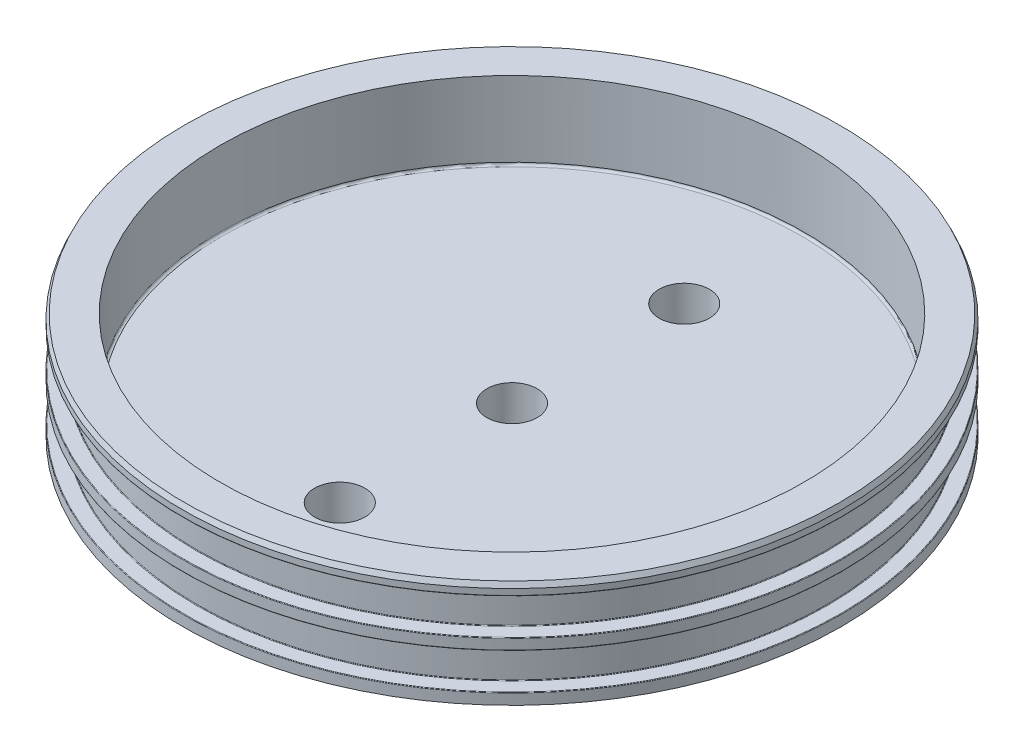
ISO-10303-21;
HEADER;
FILE_DESCRIPTION(('STEP AP214'),'2;1');
FILE_NAME('part.step','',(''),(''),'','','');
FILE_SCHEMA(('AUTOMOTIVE_DESIGN { 1 0 10303 214 1 1 1 1 }'));
ENDSEC;
DATA;
#1=APPLICATION_CONTEXT('core data for automotive mechanical design processes');
#2=APPLICATION_PROTOCOL_DEFINITION('international standard','automotive_design',2000,#1);
#3=PRODUCT_CONTEXT('',#1,'mechanical');
#4=PRODUCT('Part','Part','',(#3));
#5=PRODUCT_RELATED_PRODUCT_CATEGORY('part','',(#4));
#6=PRODUCT_DEFINITION_FORMATION('','',#4);
#7=PRODUCT_DEFINITION_CONTEXT('part definition',#1,'design');
#8=PRODUCT_DEFINITION('design','',#6,#7);
#9=PRODUCT_DEFINITION_SHAPE('','',#8);
#10=(LENGTH_UNIT() NAMED_UNIT(*) SI_UNIT(.MILLI.,.METRE.));
#11=(NAMED_UNIT(*) PLANE_ANGLE_UNIT() SI_UNIT($,.RADIAN.));
#12=(NAMED_UNIT(*) SI_UNIT($,.STERADIAN.) SOLID_ANGLE_UNIT());
#13=UNCERTAINTY_MEASURE_WITH_UNIT(LENGTH_MEASURE(1.E-05),#10,'distance_accuracy_value','');
#14=(GEOMETRIC_REPRESENTATION_CONTEXT(3) GLOBAL_UNCERTAINTY_ASSIGNED_CONTEXT((#13)) GLOBAL_UNIT_ASSIGNED_CONTEXT((#10,
#11,#12)) REPRESENTATION_CONTEXT('',''));
#15=CARTESIAN_POINT('',(0.,0.,0.));
#16=DIRECTION('',(0.,0.,1.));
#17=DIRECTION('',(1.,0.,0.));
#18=AXIS2_PLACEMENT_3D('',#15,#16,#17);
#19=CARTESIAN_POINT('',(0.,-2.54,0.));
#20=DIRECTION('',(0.,-1.,0.));
#21=DIRECTION('',(1.,0.,0.));
#22=AXIS2_PLACEMENT_3D('',#19,#20,#21);
#23=PLANE('',#22);
#24=CARTESIAN_POINT('',(0.,-2.54,38.1));
#25=DIRECTION('',(0.,-1.,0.));
#26=DIRECTION('',(0.,0.,-1.));
#27=AXIS2_PLACEMENT_3D('',#24,#25,#26);
#28=CIRCLE('',#27,5.56259999999999);
#29=CARTESIAN_POINT('',(0.,-2.54,32.5374));
#30=VERTEX_POINT('',#29);
#31=EDGE_CURVE('E80',#30,#30,#28,.T.);
#32=ORIENTED_EDGE('',*,*,#31,.F.);
#33=EDGE_LOOP('',(#32));
#34=FACE_BOUND('',#33,.T.);
#35=CARTESIAN_POINT('',(0.,-2.54,-38.1));
#36=DIRECTION('',(0.,-1.,0.));
#37=DIRECTION('',(0.,0.,-1.));
#38=AXIS2_PLACEMENT_3D('',#35,#36,#37);
#39=CIRCLE('',#38,5.5626);
#40=CARTESIAN_POINT('',(0.,-2.54,-43.6626));
#41=VERTEX_POINT('',#40);
#42=EDGE_CURVE('E66',#41,#41,#39,.T.);
#43=ORIENTED_EDGE('',*,*,#42,.F.);
#44=EDGE_LOOP('',(#43));
#45=FACE_BOUND('',#44,.T.);
#46=CARTESIAN_POINT('',(0.,-2.54,0.));
#47=DIRECTION('',(0.,-1.,0.));
#48=DIRECTION('',(1.,0.,0.));
#49=AXIS2_PLACEMENT_3D('',#46,#47,#48);
#50=CIRCLE('',#49,65.913);
#51=CARTESIAN_POINT('',(65.913,-2.53999999999999,0.));
#52=VERTEX_POINT('',#51);
#53=EDGE_CURVE('E134',#52,#52,#50,.T.);
#54=ORIENTED_EDGE('',*,*,#53,.T.);
#55=EDGE_LOOP('',(#54));
#56=FACE_BOUND('',#55,.T.);
#57=CARTESIAN_POINT('',(0.,-2.54,0.));
#58=DIRECTION('',(0.,1.,0.));
#59=DIRECTION('',(0.,0.,1.));
#60=AXIS2_PLACEMENT_3D('',#57,#58,#59);
#61=CIRCLE('',#60,5.5626);
#62=CARTESIAN_POINT('',(0.,-2.54,5.5626));
#63=VERTEX_POINT('',#62);
#64=EDGE_CURVE('E72',#63,#63,#61,.T.);
#65=ORIENTED_EDGE('',*,*,#64,.T.);
#66=EDGE_LOOP('',(#65));
#67=FACE_BOUND('',#66,.T.);
#68=ADVANCED_FACE('F44',(#34,#45,#56,#67),#23,.T.);
#69=CARTESIAN_POINT('',(0.,0.,0.));
#70=DIRECTION('',(0.,1.,0.));
#71=DIRECTION('',(-1.,0.,0.));
#72=AXIS2_PLACEMENT_3D('',#69,#70,#71);
#73=PLANE('',#72);
#74=CARTESIAN_POINT('',(0.,0.,0.));
#75=DIRECTION('',(0.,1.,0.));
#76=DIRECTION('',(-1.,0.,0.));
#77=AXIS2_PLACEMENT_3D('',#74,#75,#76);
#78=CIRCLE('',#77,66.167);
#79=CARTESIAN_POINT('',(-66.167,0.,0.));
#80=VERTEX_POINT('',#79);
#81=EDGE_CURVE('E98',#80,#80,#78,.T.);
#82=ORIENTED_EDGE('',*,*,#81,.T.);
#83=EDGE_LOOP('',(#82));
#84=FACE_BOUND('',#83,.T.);
#85=CARTESIAN_POINT('',(0.,0.,0.));
#86=DIRECTION('',(0.,1.,0.));
#87=DIRECTION('',(-1.,0.,0.));
#88=AXIS2_PLACEMENT_3D('',#85,#86,#87);
#89=CIRCLE('',#88,72.898);
#90=CARTESIAN_POINT('',(-72.898,0.,0.));
#91=VERTEX_POINT('',#90);
#92=EDGE_CURVE('E90',#91,#91,#89,.T.);
#93=ORIENTED_EDGE('',*,*,#92,.F.);
#94=EDGE_LOOP('',(#93));
#95=FACE_BOUND('',#94,.T.);
#96=ADVANCED_FACE('F208',(#84,#95),#73,.F.);
#97=CARTESIAN_POINT('',(0.,48.1922132313012,0.));
#98=DIRECTION('',(0.,1.,0.));
#99=DIRECTION('',(-1.,0.,0.));
#100=AXIS2_PLACEMENT_3D('',#97,#98,#99);
#101=CYLINDRICAL_SURFACE('',#100,72.898);
#102=CARTESIAN_POINT('',(0.,2.33679999999999,0.));
#103=DIRECTION('',(0.,-1.,0.));
#104=DIRECTION('',(1.,0.,0.));
#105=AXIS2_PLACEMENT_3D('',#102,#103,#104);
#106=CIRCLE('',#105,72.898);
#107=CARTESIAN_POINT('',(72.898,2.3368,0.));
#108=VERTEX_POINT('',#107);
#109=EDGE_CURVE('E170',#108,#108,#106,.T.);
#110=ORIENTED_EDGE('',*,*,#109,.T.);
#111=EDGE_LOOP('',(#110));
#112=FACE_BOUND('',#111,.T.);
#113=ORIENTED_EDGE('',*,*,#92,.T.);
#114=EDGE_LOOP('',(#113));
#115=FACE_BOUND('',#114,.T.);
#116=ADVANCED_FACE('F215',(#112,#115),#101,.T.);
#117=CARTESIAN_POINT('',(72.898,2.4638,0.));
#118=DIRECTION('',(0.,-1.,0.));
#119=DIRECTION('',(1.,0.,0.));
#120=AXIS2_PLACEMENT_3D('',#117,#118,#119);
#121=PLANE('',#120);
#122=CARTESIAN_POINT('',(0.,2.46379999999999,0.));
#123=DIRECTION('',(0.,-1.,0.));
#124=DIRECTION('',(1.,0.,0.));
#125=AXIS2_PLACEMENT_3D('',#122,#123,#124);
#126=CIRCLE('',#125,72.771);
#127=CARTESIAN_POINT('',(72.771,2.4638,0.));
#128=VERTEX_POINT('',#127);
#129=EDGE_CURVE('E166',#128,#128,#126,.F.);
#130=ORIENTED_EDGE('',*,*,#129,.T.);
#131=EDGE_LOOP('',(#130));
#132=FACE_BOUND('',#131,.T.);
#133=CARTESIAN_POINT('',(0.,2.46379999999999,0.));
#134=DIRECTION('',(0.,-1.,0.));
#135=DIRECTION('',(1.,0.,0.));
#136=AXIS2_PLACEMENT_3D('',#133,#134,#135);
#137=CIRCLE('',#136,69.7738);
#138=CARTESIAN_POINT('',(69.7738,2.4638,0.));
#139=VERTEX_POINT('',#138);
#140=EDGE_CURVE('E130',#139,#139,#137,.T.);
#141=ORIENTED_EDGE('',*,*,#140,.T.);
#142=EDGE_LOOP('',(#141));
#143=FACE_BOUND('',#142,.T.);
#144=ADVANCED_FACE('F289',(#132,#143),#121,.F.);
#145=CARTESIAN_POINT('',(0.,48.1922132313012,0.));
#146=DIRECTION('',(0.,1.,0.));
#147=DIRECTION('',(-1.,0.,0.));
#148=AXIS2_PLACEMENT_3D('',#145,#146,#147);
#149=CYLINDRICAL_SURFACE('',#148,69.6468);
#150=CARTESIAN_POINT('',(0.,10.3378,0.));
#151=DIRECTION('',(0.,1.,0.));
#152=DIRECTION('',(-1.,0.,0.));
#153=AXIS2_PLACEMENT_3D('',#150,#151,#152);
#154=CIRCLE('',#153,69.6468);
#155=CARTESIAN_POINT('',(-69.6468,10.3378,0.));
#156=VERTEX_POINT('',#155);
#157=EDGE_CURVE('E126',#156,#156,#154,.F.);
#158=ORIENTED_EDGE('',*,*,#157,.T.);
#159=EDGE_LOOP('',(#158));
#160=FACE_BOUND('',#159,.T.);
#161=CARTESIAN_POINT('',(0.,2.59079999999999,0.));
#162=DIRECTION('',(0.,-1.,0.));
#163=DIRECTION('',(1.,0.,0.));
#164=AXIS2_PLACEMENT_3D('',#161,#162,#163);
#165=CIRCLE('',#164,69.6468);
#166=CARTESIAN_POINT('',(69.6468,2.5908,0.));
#167=VERTEX_POINT('',#166);
#168=EDGE_CURVE('E122',#167,#167,#165,.F.);
#169=ORIENTED_EDGE('',*,*,#168,.T.);
#170=EDGE_LOOP('',(#169));
#171=FACE_BOUND('',#170,.T.);
#172=ADVANCED_FACE('F292',(#160,#171),#149,.T.);
#173=CARTESIAN_POINT('',(69.6468,10.4648,0.));
#174=DIRECTION('',(0.,1.,0.));
#175=DIRECTION('',(-1.,0.,0.));
#176=AXIS2_PLACEMENT_3D('',#173,#174,#175);
#177=PLANE('',#176);
#178=CARTESIAN_POINT('',(0.,10.4648,0.));
#179=DIRECTION('',(0.,1.,0.));
#180=DIRECTION('',(-1.,0.,0.));
#181=AXIS2_PLACEMENT_3D('',#178,#179,#180);
#182=CIRCLE('',#181,72.771);
#183=CARTESIAN_POINT('',(-72.771,10.4648,0.));
#184=VERTEX_POINT('',#183);
#185=EDGE_CURVE('E162',#184,#184,#182,.F.);
#186=ORIENTED_EDGE('',*,*,#185,.T.);
#187=EDGE_LOOP('',(#186));
#188=FACE_BOUND('',#187,.T.);
#189=CARTESIAN_POINT('',(0.,10.4648,0.));
#190=DIRECTION('',(0.,1.,0.));
#191=DIRECTION('',(-1.,0.,0.));
#192=AXIS2_PLACEMENT_3D('',#189,#190,#191);
#193=CIRCLE('',#192,69.7738);
#194=CARTESIAN_POINT('',(-69.7738,10.4648,0.));
#195=VERTEX_POINT('',#194);
#196=EDGE_CURVE('E118',#195,#195,#193,.T.);
#197=ORIENTED_EDGE('',*,*,#196,.T.);
#198=EDGE_LOOP('',(#197));
#199=FACE_BOUND('',#198,.T.);
#200=ADVANCED_FACE('F299',(#188,#199),#177,.F.);
#201=CARTESIAN_POINT('',(0.,48.1922132313012,0.));
#202=DIRECTION('',(0.,1.,0.));
#203=DIRECTION('',(-1.,0.,0.));
#204=AXIS2_PLACEMENT_3D('',#201,#202,#203);
#205=CYLINDRICAL_SURFACE('',#204,72.898);
#206=CARTESIAN_POINT('',(0.,12.8016,0.));
#207=DIRECTION('',(0.,-1.,0.));
#208=DIRECTION('',(1.,0.,0.));
#209=AXIS2_PLACEMENT_3D('',#206,#207,#208);
#210=CIRCLE('',#209,72.898);
#211=CARTESIAN_POINT('',(72.898,12.8016,0.));
#212=VERTEX_POINT('',#211);
#213=EDGE_CURVE('E158',#212,#212,#210,.T.);
#214=ORIENTED_EDGE('',*,*,#213,.T.);
#215=EDGE_LOOP('',(#214));
#216=FACE_BOUND('',#215,.T.);
#217=CARTESIAN_POINT('',(0.,10.5918,0.));
#218=DIRECTION('',(0.,1.,0.));
#219=DIRECTION('',(-1.,0.,0.));
#220=AXIS2_PLACEMENT_3D('',#217,#218,#219);
#221=CIRCLE('',#220,72.898);
#222=CARTESIAN_POINT('',(-72.898,10.5918,0.));
#223=VERTEX_POINT('',#222);
#224=EDGE_CURVE('E154',#223,#223,#221,.T.);
#225=ORIENTED_EDGE('',*,*,#224,.T.);
#226=EDGE_LOOP('',(#225));
#227=FACE_BOUND('',#226,.T.);
#228=ADVANCED_FACE('F305',(#216,#227),#205,.T.);
#229=CARTESIAN_POINT('',(72.898,12.9286,0.));
#230=DIRECTION('',(0.,-1.,0.));
#231=DIRECTION('',(1.,0.,0.));
#232=AXIS2_PLACEMENT_3D('',#229,#230,#231);
#233=PLANE('',#232);
#234=CARTESIAN_POINT('',(0.,12.9286,0.));
#235=DIRECTION('',(0.,-1.,0.));
#236=DIRECTION('',(1.,0.,0.));
#237=AXIS2_PLACEMENT_3D('',#234,#235,#236);
#238=CIRCLE('',#237,72.771);
#239=CARTESIAN_POINT('',(72.771,12.9286,0.));
#240=VERTEX_POINT('',#239);
#241=EDGE_CURVE('E150',#240,#240,#238,.F.);
#242=ORIENTED_EDGE('',*,*,#241,.T.);
#243=EDGE_LOOP('',(#242));
#244=FACE_BOUND('',#243,.T.);
#245=CARTESIAN_POINT('',(0.,12.9286,0.));
#246=DIRECTION('',(0.,-1.,0.));
#247=DIRECTION('',(1.,0.,0.));
#248=AXIS2_PLACEMENT_3D('',#245,#246,#247);
#249=CIRCLE('',#248,69.7738);
#250=CARTESIAN_POINT('',(69.7738,12.9286,0.));
#251=VERTEX_POINT('',#250);
#252=EDGE_CURVE('E114',#251,#251,#249,.T.);
#253=ORIENTED_EDGE('',*,*,#252,.T.);
#254=EDGE_LOOP('',(#253));
#255=FACE_BOUND('',#254,.T.);
#256=ADVANCED_FACE('F336',(#244,#255),#233,.F.);
#257=CARTESIAN_POINT('',(0.,48.1922132313012,0.));
#258=DIRECTION('',(0.,1.,0.));
#259=DIRECTION('',(-1.,0.,0.));
#260=AXIS2_PLACEMENT_3D('',#257,#258,#259);
#261=CYLINDRICAL_SURFACE('',#260,69.6468);
#262=CARTESIAN_POINT('',(0.,20.8026,0.));
#263=DIRECTION('',(0.,1.,0.));
#264=DIRECTION('',(-1.,0.,0.));
#265=AXIS2_PLACEMENT_3D('',#262,#263,#264);
#266=CIRCLE('',#265,69.6468);
#267=CARTESIAN_POINT('',(-69.6468,20.8026,0.));
#268=VERTEX_POINT('',#267);
#269=EDGE_CURVE('E110',#268,#268,#266,.F.);
#270=ORIENTED_EDGE('',*,*,#269,.T.);
#271=EDGE_LOOP('',(#270));
#272=FACE_BOUND('',#271,.T.);
#273=CARTESIAN_POINT('',(0.,13.0556,0.));
#274=DIRECTION('',(0.,-1.,0.));
#275=DIRECTION('',(1.,0.,0.));
#276=AXIS2_PLACEMENT_3D('',#273,#274,#275);
#277=CIRCLE('',#276,69.6468);
#278=CARTESIAN_POINT('',(69.6468,13.0556,0.));
#279=VERTEX_POINT('',#278);
#280=EDGE_CURVE('E106',#279,#279,#277,.F.);
#281=ORIENTED_EDGE('',*,*,#280,.T.);
#282=EDGE_LOOP('',(#281));
#283=FACE_BOUND('',#282,.T.);
#284=ADVANCED_FACE('F343',(#272,#283),#261,.T.);
#285=CARTESIAN_POINT('',(69.6468,20.9296,0.));
#286=DIRECTION('',(0.,1.,0.));
#287=DIRECTION('',(-1.,0.,0.));
#288=AXIS2_PLACEMENT_3D('',#285,#286,#287);
#289=PLANE('',#288);
#290=CARTESIAN_POINT('',(0.,20.9296,0.));
#291=DIRECTION('',(0.,1.,0.));
#292=DIRECTION('',(-1.,0.,0.));
#293=AXIS2_PLACEMENT_3D('',#290,#291,#292);
#294=CIRCLE('',#293,72.771);
#295=CARTESIAN_POINT('',(-72.771,20.9296,0.));
#296=VERTEX_POINT('',#295);
#297=EDGE_CURVE('E146',#296,#296,#294,.F.);
#298=ORIENTED_EDGE('',*,*,#297,.T.);
#299=EDGE_LOOP('',(#298));
#300=FACE_BOUND('',#299,.T.);
#301=CARTESIAN_POINT('',(0.,20.9296,0.));
#302=DIRECTION('',(0.,1.,0.));
#303=DIRECTION('',(-1.,0.,0.));
#304=AXIS2_PLACEMENT_3D('',#301,#302,#303);
#305=CIRCLE('',#304,69.7738);
#306=CARTESIAN_POINT('',(-69.7738,20.9296,0.));
#307=VERTEX_POINT('',#306);
#308=EDGE_CURVE('E102',#307,#307,#305,.T.);
#309=ORIENTED_EDGE('',*,*,#308,.T.);
#310=EDGE_LOOP('',(#309));
#311=FACE_BOUND('',#310,.T.);
#312=ADVANCED_FACE('F350',(#300,#311),#289,.F.);
#313=CARTESIAN_POINT('',(0.,48.1922132313012,0.));
#314=DIRECTION('',(0.,1.,0.));
#315=DIRECTION('',(-1.,0.,0.));
#316=AXIS2_PLACEMENT_3D('',#313,#314,#315);
#317=CYLINDRICAL_SURFACE('',#316,72.898);
#318=CARTESIAN_POINT('',(0.,22.3801904843811,0.));
#319=DIRECTION('',(0.,-1.,0.));
#320=DIRECTION('',(1.,0.,0.));
#321=AXIS2_PLACEMENT_3D('',#318,#319,#320);
#322=CIRCLE('',#321,72.898);
#323=CARTESIAN_POINT('',(72.898,22.3801904843811,0.));
#324=VERTEX_POINT('',#323);
#325=EDGE_CURVE('E59',#324,#324,#322,.T.);
#326=ORIENTED_EDGE('',*,*,#325,.T.);
#327=EDGE_LOOP('',(#326));
#328=FACE_BOUND('',#327,.T.);
#329=CARTESIAN_POINT('',(0.,21.0566,0.));
#330=DIRECTION('',(0.,1.,0.));
#331=DIRECTION('',(-1.,0.,0.));
#332=AXIS2_PLACEMENT_3D('',#329,#330,#331);
#333=CIRCLE('',#332,72.898);
#334=CARTESIAN_POINT('',(-72.898,21.0566,0.));
#335=VERTEX_POINT('',#334);
#336=EDGE_CURVE('E142',#335,#335,#333,.T.);
#337=ORIENTED_EDGE('',*,*,#336,.T.);
#338=EDGE_LOOP('',(#337));
#339=FACE_BOUND('',#338,.T.);
#340=ADVANCED_FACE('F181',(#328,#339),#317,.T.);
#341=CARTESIAN_POINT('',(72.898,23.4696,0.));
#342=DIRECTION('',(0.,-1.,0.));
#343=DIRECTION('',(1.,0.,0.));
#344=AXIS2_PLACEMENT_3D('',#341,#342,#343);
#345=PLANE('',#344);
#346=CARTESIAN_POINT('',(0.,23.4696,0.));
#347=DIRECTION('',(0.,-1.,0.));
#348=DIRECTION('',(1.,0.,0.));
#349=AXIS2_PLACEMENT_3D('',#346,#347,#348);
#350=CIRCLE('',#349,72.39);
#351=CARTESIAN_POINT('',(72.39,23.4696,0.));
#352=VERTEX_POINT('',#351);
#353=EDGE_CURVE('E174',#352,#352,#350,.F.);
#354=ORIENTED_EDGE('',*,*,#353,.T.);
#355=EDGE_LOOP('',(#354));
#356=FACE_BOUND('',#355,.T.);
#357=CARTESIAN_POINT('',(0.,23.4696,0.));
#358=DIRECTION('',(0.,1.,0.));
#359=DIRECTION('',(-1.,0.,0.));
#360=AXIS2_PLACEMENT_3D('',#357,#358,#359);
#361=CIRCLE('',#360,64.5668);
#362=CARTESIAN_POINT('',(-64.5668,23.4696,0.));
#363=VERTEX_POINT('',#362);
#364=EDGE_CURVE('E86',#363,#363,#361,.T.);
#365=ORIENTED_EDGE('',*,*,#364,.F.);
#366=EDGE_LOOP('',(#365));
#367=FACE_BOUND('',#366,.T.);
#368=ADVANCED_FACE('F190',(#356,#367),#345,.F.);
#369=CARTESIAN_POINT('',(0.,48.1922132313012,0.));
#370=DIRECTION('',(0.,1.,0.));
#371=DIRECTION('',(-1.,0.,0.));
#372=AXIS2_PLACEMENT_3D('',#369,#370,#371);
#373=CYLINDRICAL_SURFACE('',#372,64.5668);
#374=CARTESIAN_POINT('',(0.,6.858,0.));
#375=DIRECTION('',(0.,-1.,0.));
#376=DIRECTION('',(1.,0.,0.));
#377=AXIS2_PLACEMENT_3D('',#374,#375,#376);
#378=CIRCLE('',#377,64.5668);
#379=CARTESIAN_POINT('',(64.5668,6.858,0.));
#380=VERTEX_POINT('',#379);
#381=EDGE_CURVE('E10',#380,#380,#378,.T.);
#382=ORIENTED_EDGE('',*,*,#381,.T.);
#383=EDGE_LOOP('',(#382));
#384=FACE_BOUND('',#383,.T.);
#385=ORIENTED_EDGE('',*,*,#364,.T.);
#386=EDGE_LOOP('',(#385));
#387=FACE_BOUND('',#386,.T.);
#388=ADVANCED_FACE('F193',(#384,#387),#373,.F.);
#389=CARTESIAN_POINT('',(64.5668,6.35,0.));
#390=DIRECTION('',(0.,-1.,0.));
#391=DIRECTION('',(1.,0.,0.));
#392=AXIS2_PLACEMENT_3D('',#389,#390,#391);
#393=PLANE('',#392);
#394=CARTESIAN_POINT('',(0.,6.34999999999999,38.1));
#395=DIRECTION('',(0.,-1.,0.));
#396=DIRECTION('',(1.,0.,0.));
#397=AXIS2_PLACEMENT_3D('',#394,#395,#396);
#398=CIRCLE('',#397,5.56259999999999);
#399=CARTESIAN_POINT('',(5.56259999999999,6.34999999999999,38.1));
#400=VERTEX_POINT('',#399);
#401=EDGE_CURVE('E48',#400,#400,#398,.T.);
#402=ORIENTED_EDGE('',*,*,#401,.T.);
#403=EDGE_LOOP('',(#402));
#404=FACE_BOUND('',#403,.T.);
#405=CARTESIAN_POINT('',(0.,6.34999999999999,-38.1));
#406=DIRECTION('',(0.,-1.,0.));
#407=DIRECTION('',(1.,0.,0.));
#408=AXIS2_PLACEMENT_3D('',#405,#406,#407);
#409=CIRCLE('',#408,5.5626);
#410=CARTESIAN_POINT('',(5.5626,6.34999999999999,-38.1));
#411=VERTEX_POINT('',#410);
#412=EDGE_CURVE('E62',#411,#411,#409,.T.);
#413=ORIENTED_EDGE('',*,*,#412,.T.);
#414=EDGE_LOOP('',(#413));
#415=FACE_BOUND('',#414,.T.);
#416=CARTESIAN_POINT('',(0.,6.34999999999999,0.));
#417=DIRECTION('',(0.,-1.,0.));
#418=DIRECTION('',(1.,0.,0.));
#419=AXIS2_PLACEMENT_3D('',#416,#417,#418);
#420=CIRCLE('',#419,64.0588);
#421=CARTESIAN_POINT('',(64.0588,6.35,0.));
#422=VERTEX_POINT('',#421);
#423=EDGE_CURVE('E53',#422,#422,#420,.F.);
#424=ORIENTED_EDGE('',*,*,#423,.T.);
#425=EDGE_LOOP('',(#424));
#426=FACE_BOUND('',#425,.T.);
#427=CARTESIAN_POINT('',(0.,6.34999999999999,0.));
#428=DIRECTION('',(0.,1.,0.));
#429=DIRECTION('',(0.,0.,1.));
#430=AXIS2_PLACEMENT_3D('',#427,#428,#429);
#431=CIRCLE('',#430,5.56259999999999);
#432=CARTESIAN_POINT('',(0.,6.34999999999999,5.56259999999999));
#433=VERTEX_POINT('',#432);
#434=EDGE_CURVE('E65',#433,#433,#431,.T.);
#435=ORIENTED_EDGE('',*,*,#434,.F.);
#436=EDGE_LOOP('',(#435));
#437=FACE_BOUND('',#436,.T.);
#438=ADVANCED_FACE('F198',(#404,#415,#426,#437),#393,.F.);
#439=CARTESIAN_POINT('',(0.,-2.54,0.));
#440=DIRECTION('',(0.,1.,0.));
#441=DIRECTION('',(-1.,0.,0.));
#442=AXIS2_PLACEMENT_3D('',#439,#440,#441);
#443=CYLINDRICAL_SURFACE('',#442,66.04);
#444=CARTESIAN_POINT('',(0.,-2.413,0.));
#445=DIRECTION('',(0.,-1.,0.));
#446=DIRECTION('',(1.,0.,0.));
#447=AXIS2_PLACEMENT_3D('',#444,#445,#446);
#448=CIRCLE('',#447,66.04);
#449=CARTESIAN_POINT('',(66.04,-2.41299999999999,0.));
#450=VERTEX_POINT('',#449);
#451=EDGE_CURVE('E138',#450,#450,#448,.F.);
#452=ORIENTED_EDGE('',*,*,#451,.T.);
#453=EDGE_LOOP('',(#452));
#454=FACE_BOUND('',#453,.T.);
#455=CARTESIAN_POINT('',(0.,-0.127000000000004,0.));
#456=DIRECTION('',(0.,1.,0.));
#457=DIRECTION('',(-1.,0.,0.));
#458=AXIS2_PLACEMENT_3D('',#455,#456,#457);
#459=CIRCLE('',#458,66.04);
#460=CARTESIAN_POINT('',(-66.04,-0.127000000000012,0.));
#461=VERTEX_POINT('',#460);
#462=EDGE_CURVE('E94',#461,#461,#459,.F.);
#463=ORIENTED_EDGE('',*,*,#462,.T.);
#464=EDGE_LOOP('',(#463));
#465=FACE_BOUND('',#464,.T.);
#466=ADVANCED_FACE('F204',(#454,#465),#443,.T.);
#467=CARTESIAN_POINT('',(0.,6.34999999999999,0.));
#468=DIRECTION('',(0.,1.,0.));
#469=DIRECTION('',(0.,0.,1.));
#470=AXIS2_PLACEMENT_3D('',#467,#468,#469);
#471=CYLINDRICAL_SURFACE('',#470,5.56259999999999);
#472=ORIENTED_EDGE('',*,*,#64,.F.);
#473=EDGE_LOOP('',(#472));
#474=FACE_BOUND('',#473,.T.);
#475=ORIENTED_EDGE('',*,*,#434,.T.);
#476=EDGE_LOOP('',(#475));
#477=FACE_BOUND('',#476,.T.);
#478=ADVANCED_FACE('F222',(#474,#477),#471,.F.);
#479=CARTESIAN_POINT('',(0.,-0.127000000000004,0.));
#480=DIRECTION('',(0.,1.,0.));
#481=DIRECTION('',(-1.,0.,0.));
#482=AXIS2_PLACEMENT_3D('',#479,#480,#481);
#483=TOROIDAL_SURFACE('',#482,66.167,0.127);
#484=ORIENTED_EDGE('',*,*,#81,.F.);
#485=EDGE_LOOP('',(#484));
#486=FACE_BOUND('',#485,.T.);
#487=ORIENTED_EDGE('',*,*,#462,.F.);
#488=EDGE_LOOP('',(#487));
#489=FACE_BOUND('',#488,.T.);
#490=ADVANCED_FACE('F231',(#486,#489),#483,.F.);
#491=CARTESIAN_POINT('',(0.,20.8026,0.));
#492=DIRECTION('',(0.,1.,0.));
#493=DIRECTION('',(-1.,0.,0.));
#494=AXIS2_PLACEMENT_3D('',#491,#492,#493);
#495=TOROIDAL_SURFACE('',#494,69.7738,0.127);
#496=ORIENTED_EDGE('',*,*,#269,.F.);
#497=EDGE_LOOP('',(#496));
#498=FACE_BOUND('',#497,.T.);
#499=ORIENTED_EDGE('',*,*,#308,.F.);
#500=EDGE_LOOP('',(#499));
#501=FACE_BOUND('',#500,.T.);
#502=ADVANCED_FACE('F238',(#498,#501),#495,.F.);
#503=CARTESIAN_POINT('',(0.,13.0556,0.));
#504=DIRECTION('',(0.,-1.,0.));
#505=DIRECTION('',(1.,0.,0.));
#506=AXIS2_PLACEMENT_3D('',#503,#504,#505);
#507=TOROIDAL_SURFACE('',#506,69.7738,0.127);
#508=ORIENTED_EDGE('',*,*,#252,.F.);
#509=EDGE_LOOP('',(#508));
#510=FACE_BOUND('',#509,.T.);
#511=ORIENTED_EDGE('',*,*,#280,.F.);
#512=EDGE_LOOP('',(#511));
#513=FACE_BOUND('',#512,.T.);
#514=ADVANCED_FACE('F245',(#510,#513),#507,.F.);
#515=CARTESIAN_POINT('',(0.,10.3378,0.));
#516=DIRECTION('',(0.,1.,0.));
#517=DIRECTION('',(-1.,0.,0.));
#518=AXIS2_PLACEMENT_3D('',#515,#516,#517);
#519=TOROIDAL_SURFACE('',#518,69.7738,0.127);
#520=ORIENTED_EDGE('',*,*,#157,.F.);
#521=EDGE_LOOP('',(#520));
#522=FACE_BOUND('',#521,.T.);
#523=ORIENTED_EDGE('',*,*,#196,.F.);
#524=EDGE_LOOP('',(#523));
#525=FACE_BOUND('',#524,.T.);
#526=ADVANCED_FACE('F253',(#522,#525),#519,.F.);
#527=CARTESIAN_POINT('',(0.,2.59079999999999,0.));
#528=DIRECTION('',(0.,-1.,0.));
#529=DIRECTION('',(1.,0.,0.));
#530=AXIS2_PLACEMENT_3D('',#527,#528,#529);
#531=TOROIDAL_SURFACE('',#530,69.7738,0.127);
#532=ORIENTED_EDGE('',*,*,#140,.F.);
#533=EDGE_LOOP('',(#532));
#534=FACE_BOUND('',#533,.T.);
#535=ORIENTED_EDGE('',*,*,#168,.F.);
#536=EDGE_LOOP('',(#535));
#537=FACE_BOUND('',#536,.T.);
#538=ADVANCED_FACE('F257',(#534,#537),#531,.F.);
#539=CARTESIAN_POINT('',(0.,-2.413,0.));
#540=DIRECTION('',(0.,-1.,0.));
#541=DIRECTION('',(1.,0.,0.));
#542=AXIS2_PLACEMENT_3D('',#539,#540,#541);
#543=TOROIDAL_SURFACE('',#542,65.913,0.127);
#544=ORIENTED_EDGE('',*,*,#451,.F.);
#545=EDGE_LOOP('',(#544));
#546=FACE_BOUND('',#545,.T.);
#547=ORIENTED_EDGE('',*,*,#53,.F.);
#548=EDGE_LOOP('',(#547));
#549=FACE_BOUND('',#548,.T.);
#550=ADVANCED_FACE('F261',(#546,#549),#543,.T.);
#551=CARTESIAN_POINT('',(0.,21.0566,0.));
#552=DIRECTION('',(0.,1.,0.));
#553=DIRECTION('',(-1.,0.,0.));
#554=AXIS2_PLACEMENT_3D('',#551,#552,#553);
#555=TOROIDAL_SURFACE('',#554,72.771,0.127);
#556=ORIENTED_EDGE('',*,*,#297,.F.);
#557=EDGE_LOOP('',(#556));
#558=FACE_BOUND('',#557,.T.);
#559=ORIENTED_EDGE('',*,*,#336,.F.);
#560=EDGE_LOOP('',(#559));
#561=FACE_BOUND('',#560,.T.);
#562=ADVANCED_FACE('F264',(#558,#561),#555,.T.);
#563=CARTESIAN_POINT('',(0.,12.8016,0.));
#564=DIRECTION('',(0.,-1.,0.));
#565=DIRECTION('',(1.,0.,0.));
#566=AXIS2_PLACEMENT_3D('',#563,#564,#565);
#567=TOROIDAL_SURFACE('',#566,72.771,0.127);
#568=ORIENTED_EDGE('',*,*,#213,.F.);
#569=EDGE_LOOP('',(#568));
#570=FACE_BOUND('',#569,.T.);
#571=ORIENTED_EDGE('',*,*,#241,.F.);
#572=EDGE_LOOP('',(#571));
#573=FACE_BOUND('',#572,.T.);
#574=ADVANCED_FACE('F268',(#570,#573),#567,.T.);
#575=CARTESIAN_POINT('',(0.,10.5918,0.));
#576=DIRECTION('',(0.,1.,0.));
#577=DIRECTION('',(-1.,0.,0.));
#578=AXIS2_PLACEMENT_3D('',#575,#576,#577);
#579=TOROIDAL_SURFACE('',#578,72.771,0.127);
#580=ORIENTED_EDGE('',*,*,#185,.F.);
#581=EDGE_LOOP('',(#580));
#582=FACE_BOUND('',#581,.T.);
#583=ORIENTED_EDGE('',*,*,#224,.F.);
#584=EDGE_LOOP('',(#583));
#585=FACE_BOUND('',#584,.T.);
#586=ADVANCED_FACE('F272',(#582,#585),#579,.T.);
#587=CARTESIAN_POINT('',(0.,2.33679999999999,0.));
#588=DIRECTION('',(0.,-1.,0.));
#589=DIRECTION('',(1.,0.,0.));
#590=AXIS2_PLACEMENT_3D('',#587,#588,#589);
#591=TOROIDAL_SURFACE('',#590,72.771,0.127);
#592=ORIENTED_EDGE('',*,*,#109,.F.);
#593=EDGE_LOOP('',(#592));
#594=FACE_BOUND('',#593,.T.);
#595=ORIENTED_EDGE('',*,*,#129,.F.);
#596=EDGE_LOOP('',(#595));
#597=FACE_BOUND('',#596,.T.);
#598=ADVANCED_FACE('F187',(#594,#597),#591,.T.);
#599=CARTESIAN_POINT('',(0.,23.4696,0.));
#600=DIRECTION('',(0.,-1.,0.));
#601=DIRECTION('',(1.,0.,0.));
#602=AXIS2_PLACEMENT_3D('',#599,#600,#601);
#603=CONICAL_SURFACE('',#602,72.39,0.436332312998576);
#604=ORIENTED_EDGE('',*,*,#325,.F.);
#605=EDGE_LOOP('',(#604));
#606=FACE_BOUND('',#605,.T.);
#607=ORIENTED_EDGE('',*,*,#353,.F.);
#608=EDGE_LOOP('',(#607));
#609=FACE_BOUND('',#608,.T.);
#610=ADVANCED_FACE('F184',(#606,#609),#603,.T.);
#611=CARTESIAN_POINT('',(0.,6.858,0.));
#612=DIRECTION('',(0.,-1.,0.));
#613=DIRECTION('',(1.,0.,0.));
#614=AXIS2_PLACEMENT_3D('',#611,#612,#613);
#615=TOROIDAL_SURFACE('',#614,64.0588,0.508);
#616=ORIENTED_EDGE('',*,*,#381,.F.);
#617=EDGE_LOOP('',(#616));
#618=FACE_BOUND('',#617,.T.);
#619=ORIENTED_EDGE('',*,*,#423,.F.);
#620=EDGE_LOOP('',(#619));
#621=FACE_BOUND('',#620,.T.);
#622=ADVANCED_FACE('F46',(#618,#621),#615,.F.);
#623=CARTESIAN_POINT('',(0.,-2.54,-38.1));
#624=DIRECTION('',(0.,-1.,0.));
#625=DIRECTION('',(0.,0.,-1.));
#626=AXIS2_PLACEMENT_3D('',#623,#624,#625);
#627=CYLINDRICAL_SURFACE('',#626,5.5626);
#628=ORIENTED_EDGE('',*,*,#42,.T.);
#629=EDGE_LOOP('',(#628));
#630=FACE_BOUND('',#629,.T.);
#631=ORIENTED_EDGE('',*,*,#412,.F.);
#632=EDGE_LOOP('',(#631));
#633=FACE_BOUND('',#632,.T.);
#634=ADVANCED_FACE('F465',(#630,#633),#627,.F.);
#635=CARTESIAN_POINT('',(0.,-2.54,38.1));
#636=DIRECTION('',(0.,-1.,0.));
#637=DIRECTION('',(0.,0.,-1.));
#638=AXIS2_PLACEMENT_3D('',#635,#636,#637);
#639=CYLINDRICAL_SURFACE('',#638,5.56259999999999);
#640=ORIENTED_EDGE('',*,*,#31,.T.);
#641=EDGE_LOOP('',(#640));
#642=FACE_BOUND('',#641,.T.);
#643=ORIENTED_EDGE('',*,*,#401,.F.);
#644=EDGE_LOOP('',(#643));
#645=FACE_BOUND('',#644,.T.);
#646=ADVANCED_FACE('F473',(#642,#645),#639,.F.);
#647=CLOSED_SHELL('',(#68,#96,#116,#144,#172,#200,#228,#256,#284,#312,#340,#368,#388,#438,#466,
#478,#490,#502,#514,#526,#538,#550,#562,#574,#586,#598,#610,#622,#634,#646));
#648=MANIFOLD_SOLID_BREP('B2',#647);
#649=ADVANCED_BREP_SHAPE_REPRESENTATION('',(#18,#648),#14);
#650=SHAPE_DEFINITION_REPRESENTATION(#9,#649);
ENDSEC;
END-ISO-10303-21;
